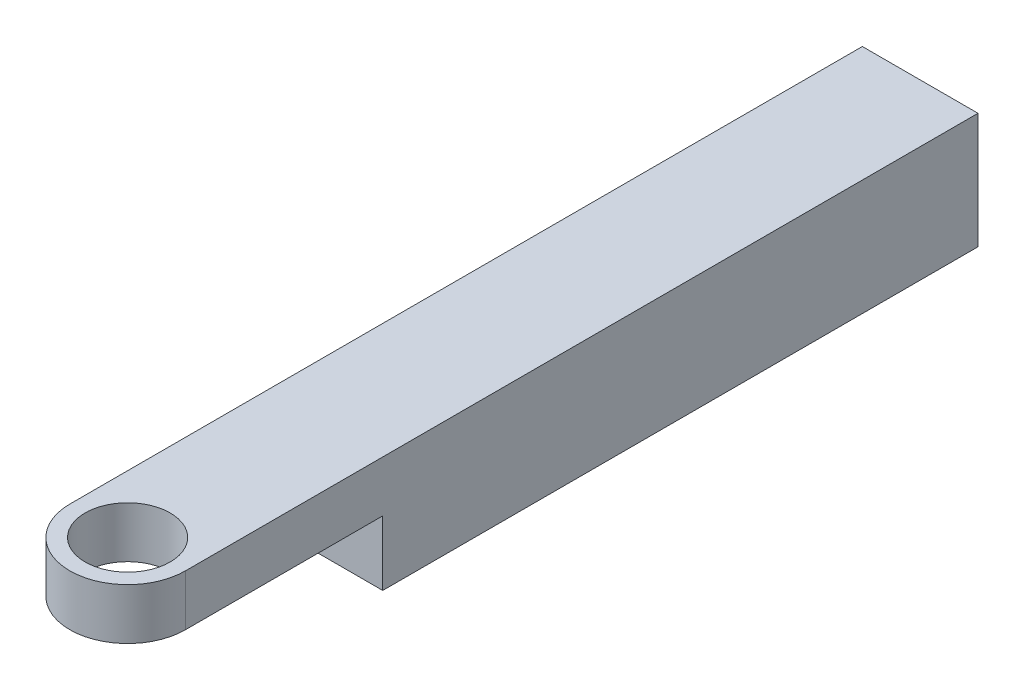
ISO-10303-21;
HEADER;
FILE_DESCRIPTION(('STEP AP214'),'2;1');
FILE_NAME('part.step','',(''),(''),'','','');
FILE_SCHEMA(('AUTOMOTIVE_DESIGN { 1 0 10303 214 1 1 1 1 }'));
ENDSEC;
DATA;
#1=APPLICATION_CONTEXT('core data for automotive mechanical design processes');
#2=APPLICATION_PROTOCOL_DEFINITION('international standard','automotive_design',2000,#1);
#3=PRODUCT_CONTEXT('',#1,'mechanical');
#4=PRODUCT('Part','Part','',(#3));
#5=PRODUCT_RELATED_PRODUCT_CATEGORY('part','',(#4));
#6=PRODUCT_DEFINITION_FORMATION('','',#4);
#7=PRODUCT_DEFINITION_CONTEXT('part definition',#1,'design');
#8=PRODUCT_DEFINITION('design','',#6,#7);
#9=PRODUCT_DEFINITION_SHAPE('','',#8);
#10=(LENGTH_UNIT() NAMED_UNIT(*) SI_UNIT(.MILLI.,.METRE.));
#11=(NAMED_UNIT(*) PLANE_ANGLE_UNIT() SI_UNIT($,.RADIAN.));
#12=(NAMED_UNIT(*) SI_UNIT($,.STERADIAN.) SOLID_ANGLE_UNIT());
#13=UNCERTAINTY_MEASURE_WITH_UNIT(LENGTH_MEASURE(1.E-05),#10,'distance_accuracy_value','');
#14=(GEOMETRIC_REPRESENTATION_CONTEXT(3) GLOBAL_UNCERTAINTY_ASSIGNED_CONTEXT((#13)) GLOBAL_UNIT_ASSIGNED_CONTEXT((#10,
#11,#12)) REPRESENTATION_CONTEXT('',''));
#15=CARTESIAN_POINT('',(0.,0.,0.));
#16=DIRECTION('',(0.,0.,1.));
#17=DIRECTION('',(1.,0.,0.));
#18=AXIS2_PLACEMENT_3D('',#15,#16,#17);
#19=CARTESIAN_POINT('',(-3.4,3.8,46.6));
#20=DIRECTION('',(0.,-1.,0.));
#21=DIRECTION('',(0.,0.,-1.));
#22=AXIS2_PLACEMENT_3D('',#19,#20,#21);
#23=CYLINDRICAL_SURFACE('',#22,3.4);
#24=DIRECTION('',(0.,1.,0.));
#25=VECTOR('',#24,1.);
#26=CARTESIAN_POINT('',(-6.8,3.8,46.6));
#27=LINE('',#26,#25);
#28=CARTESIAN_POINT('',(-6.8,3.8,46.6));
#29=VERTEX_POINT('',#28);
#30=CARTESIAN_POINT('',(-6.8,6.8,46.6));
#31=VERTEX_POINT('',#30);
#32=EDGE_CURVE('E288',#29,#31,#27,.T.);
#33=ORIENTED_EDGE('',*,*,#32,.F.);
#34=CARTESIAN_POINT('',(-3.4,3.8,46.6));
#35=DIRECTION('',(0.,1.,0.));
#36=DIRECTION('',(-1.,0.,0.));
#37=AXIS2_PLACEMENT_3D('',#34,#35,#36);
#38=CIRCLE('',#37,3.4);
#39=CARTESIAN_POINT('',(0.,3.8,46.6));
#40=VERTEX_POINT('',#39);
#41=EDGE_CURVE('E50',#40,#29,#38,.F.);
#42=ORIENTED_EDGE('',*,*,#41,.F.);
#43=DIRECTION('',(0.,1.,0.));
#44=VECTOR('',#43,1.);
#45=CARTESIAN_POINT('',(0.,3.8,46.6));
#46=LINE('',#45,#44);
#47=CARTESIAN_POINT('',(0.,6.8,46.6));
#48=VERTEX_POINT('',#47);
#49=EDGE_CURVE('E165',#48,#40,#46,.F.);
#50=ORIENTED_EDGE('',*,*,#49,.F.);
#51=CARTESIAN_POINT('',(-3.4,6.8,46.6));
#52=DIRECTION('',(0.,-1.,0.));
#53=DIRECTION('',(1.,0.,0.));
#54=AXIS2_PLACEMENT_3D('',#51,#52,#53);
#55=CIRCLE('',#54,3.4);
#56=EDGE_CURVE('E11',#31,#48,#55,.F.);
#57=ORIENTED_EDGE('',*,*,#56,.F.);
#58=EDGE_LOOP('',(#33,#42,#50,#57));
#59=FACE_BOUND('',#58,.T.);
#60=ADVANCED_FACE('F41',(#59),#23,.T.);
#61=CARTESIAN_POINT('',(0.,0.,50.));
#62=DIRECTION('',(0.,1.,0.));
#63=DIRECTION('',(-1.,0.,0.));
#64=AXIS2_PLACEMENT_3D('',#61,#62,#63);
#65=PLANE('',#64);
#66=DIRECTION('',(1.,0.,0.));
#67=VECTOR('',#66,1.);
#68=CARTESIAN_POINT('',(0.,0.,35.));
#69=LINE('',#68,#67);
#70=CARTESIAN_POINT('',(-6.8,0.,35.));
#71=VERTEX_POINT('',#70);
#72=CARTESIAN_POINT('',(0.,0.,35.));
#73=VERTEX_POINT('',#72);
#74=EDGE_CURVE('E157',#71,#73,#69,.T.);
#75=ORIENTED_EDGE('',*,*,#74,.F.);
#76=DIRECTION('',(0.,0.,-1.));
#77=VECTOR('',#76,1.);
#78=CARTESIAN_POINT('',(-6.8,0.,50.));
#79=LINE('',#78,#77);
#80=CARTESIAN_POINT('',(-6.8,0.,0.));
#81=VERTEX_POINT('',#80);
#82=EDGE_CURVE('E275',#71,#81,#79,.T.);
#83=ORIENTED_EDGE('',*,*,#82,.T.);
#84=DIRECTION('',(1.,0.,0.));
#85=VECTOR('',#84,1.);
#86=CARTESIAN_POINT('',(0.,0.,0.));
#87=LINE('',#86,#85);
#88=CARTESIAN_POINT('',(0.,0.,0.));
#89=VERTEX_POINT('',#88);
#90=EDGE_CURVE('E268',#81,#89,#87,.T.);
#91=ORIENTED_EDGE('',*,*,#90,.T.);
#92=DIRECTION('',(0.,0.,-1.));
#93=VECTOR('',#92,1.);
#94=CARTESIAN_POINT('',(0.,0.,50.));
#95=LINE('',#94,#93);
#96=EDGE_CURVE('E272',#73,#89,#95,.T.);
#97=ORIENTED_EDGE('',*,*,#96,.F.);
#98=EDGE_LOOP('',(#75,#83,#91,#97));
#99=FACE_BOUND('',#98,.T.);
#100=ADVANCED_FACE('F326',(#99),#65,.F.);
#101=CARTESIAN_POINT('',(-3.4,3.4,50.));
#102=DIRECTION('',(0.,0.,-1.));
#103=DIRECTION('',(-1.,0.,0.));
#104=AXIS2_PLACEMENT_3D('',#101,#102,#103);
#105=CYLINDRICAL_SURFACE('',#104,1.75);
#106=DIRECTION('',(0.,0.,-1.));
#107=VECTOR('',#106,1.);
#108=CARTESIAN_POINT('',(-1.69632749625992,3.8,50.));
#109=LINE('',#108,#107);
#110=CARTESIAN_POINT('',(-1.69632749625992,3.8,43.));
#111=VERTEX_POINT('',#110);
#112=CARTESIAN_POINT('',(-1.69632749625992,3.8,35.));
#113=VERTEX_POINT('',#112);
#114=EDGE_CURVE('E146',#111,#113,#109,.T.);
#115=ORIENTED_EDGE('',*,*,#114,.F.);
#116=CARTESIAN_POINT('',(-3.4,3.4,43.));
#117=DIRECTION('',(0.,0.,-1.));
#118=DIRECTION('',(-1.,0.,0.));
#119=AXIS2_PLACEMENT_3D('',#116,#117,#118);
#120=CIRCLE('',#119,1.75);
#121=CARTESIAN_POINT('',(-5.10367250374008,3.8,43.));
#122=VERTEX_POINT('',#121);
#123=EDGE_CURVE('E184',#122,#111,#120,.T.);
#124=ORIENTED_EDGE('',*,*,#123,.F.);
#125=DIRECTION('',(0.,0.,-1.));
#126=VECTOR('',#125,1.);
#127=CARTESIAN_POINT('',(-5.10367250374008,3.8,50.));
#128=LINE('',#127,#126);
#129=CARTESIAN_POINT('',(-5.10367250374008,3.8,35.));
#130=VERTEX_POINT('',#129);
#131=EDGE_CURVE('E172',#130,#122,#128,.F.);
#132=ORIENTED_EDGE('',*,*,#131,.F.);
#133=CARTESIAN_POINT('',(-3.4,3.4,35.));
#134=DIRECTION('',(0.,0.,1.));
#135=DIRECTION('',(1.,0.,0.));
#136=AXIS2_PLACEMENT_3D('',#133,#134,#135);
#137=CIRCLE('',#136,1.75);
#138=EDGE_CURVE('E180',#130,#113,#137,.T.);
#139=ORIENTED_EDGE('',*,*,#138,.T.);
#140=EDGE_LOOP('',(#115,#124,#132,#139));
#141=FACE_BOUND('',#140,.T.);
#142=CARTESIAN_POINT('',(-3.4,3.4,8.));
#143=DIRECTION('',(0.,0.,-1.));
#144=DIRECTION('',(-1.,0.,0.));
#145=AXIS2_PLACEMENT_3D('',#142,#143,#144);
#146=CIRCLE('',#145,1.75);
#147=CARTESIAN_POINT('',(-5.15,3.4,8.));
#148=VERTEX_POINT('',#147);
#149=EDGE_CURVE('E240',#148,#148,#146,.T.);
#150=ORIENTED_EDGE('',*,*,#149,.T.);
#151=EDGE_LOOP('',(#150));
#152=FACE_BOUND('',#151,.T.);
#153=ADVANCED_FACE('F331',(#141,#152),#105,.F.);
#154=CARTESIAN_POINT('',(0.,0.,0.));
#155=DIRECTION('',(0.,0.,1.));
#156=DIRECTION('',(1.,0.,0.));
#157=AXIS2_PLACEMENT_3D('',#154,#155,#156);
#158=PLANE('',#157);
#159=DIRECTION('',(0.5,0.866025403784438,0.));
#160=VECTOR('',#159,1.);
#161=CARTESIAN_POINT('',(-6.57542648054294,3.4,0.));
#162=LINE('',#161,#160);
#163=CARTESIAN_POINT('',(-6.57542648054294,3.4,0.));
#164=VERTEX_POINT('',#163);
#165=CARTESIAN_POINT('',(-4.98771324027147,6.15,0.));
#166=VERTEX_POINT('',#165);
#167=EDGE_CURVE('E218',#164,#166,#162,.T.);
#168=ORIENTED_EDGE('',*,*,#167,.F.);
#169=DIRECTION('',(-0.5,0.866025403784439,0.));
#170=VECTOR('',#169,1.);
#171=CARTESIAN_POINT('',(-4.98771324027147,0.649999999999999,0.));
#172=LINE('',#171,#170);
#173=CARTESIAN_POINT('',(-4.98771324027147,0.649999999999999,0.));
#174=VERTEX_POINT('',#173);
#175=EDGE_CURVE('E183',#174,#164,#172,.T.);
#176=ORIENTED_EDGE('',*,*,#175,.F.);
#177=DIRECTION('',(-1.,0.,0.));
#178=VECTOR('',#177,1.);
#179=CARTESIAN_POINT('',(-1.81228675972853,0.65,0.));
#180=LINE('',#179,#178);
#181=CARTESIAN_POINT('',(-1.81228675972853,0.65,0.));
#182=VERTEX_POINT('',#181);
#183=EDGE_CURVE('E195',#182,#174,#180,.T.);
#184=ORIENTED_EDGE('',*,*,#183,.F.);
#185=DIRECTION('',(-0.5,-0.866025403784438,0.));
#186=VECTOR('',#185,1.);
#187=CARTESIAN_POINT('',(-0.224573519457058,3.4,0.));
#188=LINE('',#187,#186);
#189=CARTESIAN_POINT('',(-0.224573519457058,3.4,0.));
#190=VERTEX_POINT('',#189);
#191=EDGE_CURVE('E230',#190,#182,#188,.T.);
#192=ORIENTED_EDGE('',*,*,#191,.F.);
#193=DIRECTION('',(0.5,-0.866025403784439,0.));
#194=VECTOR('',#193,1.);
#195=CARTESIAN_POINT('',(-1.81228675972853,6.15,0.));
#196=LINE('',#195,#194);
#197=CARTESIAN_POINT('',(-1.81228675972853,6.15,0.));
#198=VERTEX_POINT('',#197);
#199=EDGE_CURVE('E226',#198,#190,#196,.T.);
#200=ORIENTED_EDGE('',*,*,#199,.F.);
#201=DIRECTION('',(1.,0.,0.));
#202=VECTOR('',#201,1.);
#203=CARTESIAN_POINT('',(-4.98771324027147,6.15,0.));
#204=LINE('',#203,#202);
#205=EDGE_CURVE('E222',#166,#198,#204,.T.);
#206=ORIENTED_EDGE('',*,*,#205,.F.);
#207=EDGE_LOOP('',(#168,#176,#184,#192,#200,#206));
#208=FACE_BOUND('',#207,.T.);
#209=DIRECTION('',(0.,1.,0.));
#210=VECTOR('',#209,1.);
#211=CARTESIAN_POINT('',(0.,0.,0.));
#212=LINE('',#211,#210);
#213=CARTESIAN_POINT('',(0.,6.8,0.));
#214=VERTEX_POINT('',#213);
#215=EDGE_CURVE('E256',#89,#214,#212,.T.);
#216=ORIENTED_EDGE('',*,*,#215,.F.);
#217=ORIENTED_EDGE('',*,*,#90,.F.);
#218=DIRECTION('',(0.,-1.,0.));
#219=VECTOR('',#218,1.);
#220=CARTESIAN_POINT('',(-6.8,0.,0.));
#221=LINE('',#220,#219);
#222=CARTESIAN_POINT('',(-6.8,6.8,0.));
#223=VERTEX_POINT('',#222);
#224=EDGE_CURVE('E264',#223,#81,#221,.T.);
#225=ORIENTED_EDGE('',*,*,#224,.F.);
#226=DIRECTION('',(-1.,0.,0.));
#227=VECTOR('',#226,1.);
#228=CARTESIAN_POINT('',(0.,6.8,0.));
#229=LINE('',#228,#227);
#230=EDGE_CURVE('E260',#214,#223,#229,.T.);
#231=ORIENTED_EDGE('',*,*,#230,.F.);
#232=EDGE_LOOP('',(#216,#217,#225,#231));
#233=FACE_BOUND('',#232,.T.);
#234=ADVANCED_FACE('F338',(#208,#233),#158,.F.);
#235=CARTESIAN_POINT('',(0.,0.,50.));
#236=DIRECTION('',(-1.,0.,0.));
#237=DIRECTION('',(0.,-1.,0.));
#238=AXIS2_PLACEMENT_3D('',#235,#236,#237);
#239=PLANE('',#238);
#240=DIRECTION('',(0.,0.,-1.));
#241=VECTOR('',#240,1.);
#242=CARTESIAN_POINT('',(0.,6.8,50.));
#243=LINE('',#242,#241);
#244=EDGE_CURVE('E189',#48,#214,#243,.T.);
#245=ORIENTED_EDGE('',*,*,#244,.F.);
#246=ORIENTED_EDGE('',*,*,#49,.T.);
#247=DIRECTION('',(0.,0.,1.));
#248=VECTOR('',#247,1.);
#249=CARTESIAN_POINT('',(0.,3.8,35.));
#250=LINE('',#249,#248);
#251=CARTESIAN_POINT('',(0.,3.8,35.));
#252=VERTEX_POINT('',#251);
#253=EDGE_CURVE('E144',#252,#40,#250,.T.);
#254=ORIENTED_EDGE('',*,*,#253,.F.);
#255=DIRECTION('',(0.,1.,0.));
#256=VECTOR('',#255,1.);
#257=CARTESIAN_POINT('',(0.,0.,35.));
#258=LINE('',#257,#256);
#259=EDGE_CURVE('E154',#73,#252,#258,.T.);
#260=ORIENTED_EDGE('',*,*,#259,.F.);
#261=ORIENTED_EDGE('',*,*,#96,.T.);
#262=ORIENTED_EDGE('',*,*,#215,.T.);
#263=EDGE_LOOP('',(#245,#246,#254,#260,#261,#262));
#264=FACE_BOUND('',#263,.T.);
#265=ADVANCED_FACE('F164',(#264),#239,.F.);
#266=CARTESIAN_POINT('',(0.,6.8,50.));
#267=DIRECTION('',(0.,-1.,0.));
#268=DIRECTION('',(1.,0.,0.));
#269=AXIS2_PLACEMENT_3D('',#266,#267,#268);
#270=PLANE('',#269);
#271=CARTESIAN_POINT('',(-3.4,6.8,46.6));
#272=DIRECTION('',(0.,-1.,0.));
#273=DIRECTION('',(1.,0.,0.));
#274=AXIS2_PLACEMENT_3D('',#271,#272,#273);
#275=CIRCLE('',#274,2.5);
#276=CARTESIAN_POINT('',(-0.899999999999998,6.8,46.6));
#277=VERTEX_POINT('',#276);
#278=EDGE_CURVE('E161',#277,#277,#275,.T.);
#279=ORIENTED_EDGE('',*,*,#278,.T.);
#280=EDGE_LOOP('',(#279));
#281=FACE_BOUND('',#280,.T.);
#282=DIRECTION('',(0.,0.,-1.));
#283=VECTOR('',#282,1.);
#284=CARTESIAN_POINT('',(-6.8,6.8,50.));
#285=LINE('',#284,#283);
#286=EDGE_CURVE('E278',#31,#223,#285,.T.);
#287=ORIENTED_EDGE('',*,*,#286,.F.);
#288=ORIENTED_EDGE('',*,*,#56,.T.);
#289=ORIENTED_EDGE('',*,*,#244,.T.);
#290=ORIENTED_EDGE('',*,*,#230,.T.);
#291=EDGE_LOOP('',(#287,#288,#289,#290));
#292=FACE_BOUND('',#291,.T.);
#293=ADVANCED_FACE('F346',(#281,#292),#270,.F.);
#294=CARTESIAN_POINT('',(-6.8,0.,50.));
#295=DIRECTION('',(1.,0.,0.));
#296=DIRECTION('',(0.,0.,-1.));
#297=AXIS2_PLACEMENT_3D('',#294,#295,#296);
#298=PLANE('',#297);
#299=DIRECTION('',(0.,0.,1.));
#300=VECTOR('',#299,1.);
#301=CARTESIAN_POINT('',(-6.8,3.8,35.));
#302=LINE('',#301,#300);
#303=CARTESIAN_POINT('',(-6.8,3.8,35.));
#304=VERTEX_POINT('',#303);
#305=EDGE_CURVE('E167',#304,#29,#302,.T.);
#306=ORIENTED_EDGE('',*,*,#305,.T.);
#307=ORIENTED_EDGE('',*,*,#32,.T.);
#308=ORIENTED_EDGE('',*,*,#286,.T.);
#309=ORIENTED_EDGE('',*,*,#224,.T.);
#310=ORIENTED_EDGE('',*,*,#82,.F.);
#311=DIRECTION('',(0.,-1.,0.));
#312=VECTOR('',#311,1.);
#313=CARTESIAN_POINT('',(-6.8,0.,35.));
#314=LINE('',#313,#312);
#315=EDGE_CURVE('E150',#304,#71,#314,.T.);
#316=ORIENTED_EDGE('',*,*,#315,.F.);
#317=EDGE_LOOP('',(#306,#307,#308,#309,#310,#316));
#318=FACE_BOUND('',#317,.T.);
#319=ADVANCED_FACE('F298',(#318),#298,.F.);
#320=CARTESIAN_POINT('',(-4.98771324027147,0.649999999999999,8.));
#321=DIRECTION('',(-0.866025403784439,-0.5,0.));
#322=DIRECTION('',(0.5,-0.866025403784439,0.));
#323=AXIS2_PLACEMENT_3D('',#320,#321,#322);
#324=PLANE('',#323);
#325=ORIENTED_EDGE('',*,*,#175,.T.);
#326=DIRECTION('',(0.,0.,-1.));
#327=VECTOR('',#326,1.);
#328=CARTESIAN_POINT('',(-6.57542648054294,3.4,8.));
#329=LINE('',#328,#327);
#330=CARTESIAN_POINT('',(-6.57542648054294,3.4,8.));
#331=VERTEX_POINT('',#330);
#332=EDGE_CURVE('E215',#331,#164,#329,.T.);
#333=ORIENTED_EDGE('',*,*,#332,.F.);
#334=DIRECTION('',(-0.5,0.866025403784439,0.));
#335=VECTOR('',#334,1.);
#336=CARTESIAN_POINT('',(-4.98771324027147,0.649999999999999,8.));
#337=LINE('',#336,#335);
#338=CARTESIAN_POINT('',(-4.98771324027147,0.649999999999999,8.));
#339=VERTEX_POINT('',#338);
#340=EDGE_CURVE('E190',#339,#331,#337,.T.);
#341=ORIENTED_EDGE('',*,*,#340,.F.);
#342=DIRECTION('',(0.,0.,-1.));
#343=VECTOR('',#342,1.);
#344=CARTESIAN_POINT('',(-4.98771324027147,0.649999999999999,8.));
#345=LINE('',#344,#343);
#346=EDGE_CURVE('E237',#339,#174,#345,.T.);
#347=ORIENTED_EDGE('',*,*,#346,.T.);
#348=EDGE_LOOP('',(#325,#333,#341,#347));
#349=FACE_BOUND('',#348,.T.);
#350=ADVANCED_FACE('F345',(#349),#324,.F.);
#351=CARTESIAN_POINT('',(-1.81228675972853,0.65,8.));
#352=DIRECTION('',(0.,-1.,0.));
#353=DIRECTION('',(1.,0.,0.));
#354=AXIS2_PLACEMENT_3D('',#351,#352,#353);
#355=PLANE('',#354);
#356=ORIENTED_EDGE('',*,*,#183,.T.);
#357=ORIENTED_EDGE('',*,*,#346,.F.);
#358=DIRECTION('',(-1.,0.,0.));
#359=VECTOR('',#358,1.);
#360=CARTESIAN_POINT('',(-1.81228675972853,0.65,8.));
#361=LINE('',#360,#359);
#362=CARTESIAN_POINT('',(-1.81228675972853,0.65,8.));
#363=VERTEX_POINT('',#362);
#364=EDGE_CURVE('E211',#363,#339,#361,.T.);
#365=ORIENTED_EDGE('',*,*,#364,.F.);
#366=DIRECTION('',(0.,0.,-1.));
#367=VECTOR('',#366,1.);
#368=CARTESIAN_POINT('',(-1.81228675972853,0.65,8.));
#369=LINE('',#368,#367);
#370=EDGE_CURVE('E241',#363,#182,#369,.T.);
#371=ORIENTED_EDGE('',*,*,#370,.T.);
#372=EDGE_LOOP('',(#356,#357,#365,#371));
#373=FACE_BOUND('',#372,.T.);
#374=ADVANCED_FACE('F375',(#373),#355,.F.);
#375=CARTESIAN_POINT('',(-0.224573519457058,3.4,8.));
#376=DIRECTION('',(0.866025403784439,-0.5,0.));
#377=DIRECTION('',(0.5,0.866025403784439,0.));
#378=AXIS2_PLACEMENT_3D('',#375,#376,#377);
#379=PLANE('',#378);
#380=ORIENTED_EDGE('',*,*,#191,.T.);
#381=ORIENTED_EDGE('',*,*,#370,.F.);
#382=DIRECTION('',(-0.5,-0.866025403784438,0.));
#383=VECTOR('',#382,1.);
#384=CARTESIAN_POINT('',(-0.224573519457058,3.4,8.));
#385=LINE('',#384,#383);
#386=CARTESIAN_POINT('',(-0.224573519457058,3.4,8.));
#387=VERTEX_POINT('',#386);
#388=EDGE_CURVE('E207',#387,#363,#385,.T.);
#389=ORIENTED_EDGE('',*,*,#388,.F.);
#390=DIRECTION('',(0.,0.,-1.));
#391=VECTOR('',#390,1.);
#392=CARTESIAN_POINT('',(-0.224573519457058,3.4,8.));
#393=LINE('',#392,#391);
#394=EDGE_CURVE('E244',#387,#190,#393,.T.);
#395=ORIENTED_EDGE('',*,*,#394,.T.);
#396=EDGE_LOOP('',(#380,#381,#389,#395));
#397=FACE_BOUND('',#396,.T.);
#398=ADVANCED_FACE('F378',(#397),#379,.F.);
#399=CARTESIAN_POINT('',(-1.81228675972853,6.15,8.));
#400=DIRECTION('',(0.866025403784439,0.5,0.));
#401=DIRECTION('',(-0.5,0.866025403784439,0.));
#402=AXIS2_PLACEMENT_3D('',#399,#400,#401);
#403=PLANE('',#402);
#404=ORIENTED_EDGE('',*,*,#199,.T.);
#405=ORIENTED_EDGE('',*,*,#394,.F.);
#406=DIRECTION('',(0.5,-0.866025403784439,0.));
#407=VECTOR('',#406,1.);
#408=CARTESIAN_POINT('',(-1.81228675972853,6.15,8.));
#409=LINE('',#408,#407);
#410=CARTESIAN_POINT('',(-1.81228675972853,6.15,8.));
#411=VERTEX_POINT('',#410);
#412=EDGE_CURVE('E203',#411,#387,#409,.T.);
#413=ORIENTED_EDGE('',*,*,#412,.F.);
#414=DIRECTION('',(0.,0.,-1.));
#415=VECTOR('',#414,1.);
#416=CARTESIAN_POINT('',(-1.81228675972853,6.15,8.));
#417=LINE('',#416,#415);
#418=EDGE_CURVE('E247',#411,#198,#417,.T.);
#419=ORIENTED_EDGE('',*,*,#418,.T.);
#420=EDGE_LOOP('',(#404,#405,#413,#419));
#421=FACE_BOUND('',#420,.T.);
#422=ADVANCED_FACE('F382',(#421),#403,.F.);
#423=CARTESIAN_POINT('',(-4.98771324027147,6.15,8.));
#424=DIRECTION('',(0.,1.,0.));
#425=DIRECTION('',(0.,0.,1.));
#426=AXIS2_PLACEMENT_3D('',#423,#424,#425);
#427=PLANE('',#426);
#428=ORIENTED_EDGE('',*,*,#205,.T.);
#429=ORIENTED_EDGE('',*,*,#418,.F.);
#430=DIRECTION('',(1.,0.,0.));
#431=VECTOR('',#430,1.);
#432=CARTESIAN_POINT('',(-4.98771324027147,6.15,8.));
#433=LINE('',#432,#431);
#434=CARTESIAN_POINT('',(-4.98771324027147,6.15,8.));
#435=VERTEX_POINT('',#434);
#436=EDGE_CURVE('E199',#435,#411,#433,.T.);
#437=ORIENTED_EDGE('',*,*,#436,.F.);
#438=DIRECTION('',(0.,0.,-1.));
#439=VECTOR('',#438,1.);
#440=CARTESIAN_POINT('',(-4.98771324027147,6.15,8.));
#441=LINE('',#440,#439);
#442=EDGE_CURVE('E250',#435,#166,#441,.T.);
#443=ORIENTED_EDGE('',*,*,#442,.T.);
#444=EDGE_LOOP('',(#428,#429,#437,#443));
#445=FACE_BOUND('',#444,.T.);
#446=ADVANCED_FACE('F384',(#445),#427,.F.);
#447=CARTESIAN_POINT('',(-6.57542648054294,3.4,8.));
#448=DIRECTION('',(-0.866025403784439,0.5,0.));
#449=DIRECTION('',(-0.5,-0.866025403784438,0.));
#450=AXIS2_PLACEMENT_3D('',#447,#448,#449);
#451=PLANE('',#450);
#452=ORIENTED_EDGE('',*,*,#167,.T.);
#453=ORIENTED_EDGE('',*,*,#442,.F.);
#454=DIRECTION('',(0.5,0.866025403784438,0.));
#455=VECTOR('',#454,1.);
#456=CARTESIAN_POINT('',(-6.57542648054294,3.4,8.));
#457=LINE('',#456,#455);
#458=EDGE_CURVE('E194',#331,#435,#457,.T.);
#459=ORIENTED_EDGE('',*,*,#458,.F.);
#460=ORIENTED_EDGE('',*,*,#332,.T.);
#461=EDGE_LOOP('',(#452,#453,#459,#460));
#462=FACE_BOUND('',#461,.T.);
#463=ADVANCED_FACE('F368',(#462),#451,.F.);
#464=CARTESIAN_POINT('',(0.,0.,8.));
#465=DIRECTION('',(0.,0.,-1.));
#466=DIRECTION('',(-1.,0.,0.));
#467=AXIS2_PLACEMENT_3D('',#464,#465,#466);
#468=PLANE('',#467);
#469=ORIENTED_EDGE('',*,*,#149,.F.);
#470=EDGE_LOOP('',(#469));
#471=FACE_BOUND('',#470,.T.);
#472=ORIENTED_EDGE('',*,*,#340,.T.);
#473=ORIENTED_EDGE('',*,*,#458,.T.);
#474=ORIENTED_EDGE('',*,*,#436,.T.);
#475=ORIENTED_EDGE('',*,*,#412,.T.);
#476=ORIENTED_EDGE('',*,*,#388,.T.);
#477=ORIENTED_EDGE('',*,*,#364,.T.);
#478=EDGE_LOOP('',(#472,#473,#474,#475,#476,#477));
#479=FACE_BOUND('',#478,.T.);
#480=ADVANCED_FACE('F322',(#471,#479),#468,.T.);
#481=CARTESIAN_POINT('',(0.,0.,43.));
#482=DIRECTION('',(0.,0.,-1.));
#483=DIRECTION('',(-1.,0.,0.));
#484=AXIS2_PLACEMENT_3D('',#481,#482,#483);
#485=PLANE('',#484);
#486=DIRECTION('',(1.,0.,0.));
#487=VECTOR('',#486,1.);
#488=CARTESIAN_POINT('',(0.,3.8,43.));
#489=LINE('',#488,#487);
#490=EDGE_CURVE('E188',#122,#111,#489,.T.);
#491=ORIENTED_EDGE('',*,*,#490,.F.);
#492=ORIENTED_EDGE('',*,*,#123,.T.);
#493=EDGE_LOOP('',(#491,#492));
#494=FACE_BOUND('',#493,.T.);
#495=ADVANCED_FACE('F315',(#494),#485,.T.);
#496=CARTESIAN_POINT('',(0.,3.8,35.));
#497=DIRECTION('',(0.,1.,0.));
#498=DIRECTION('',(-1.,0.,0.));
#499=AXIS2_PLACEMENT_3D('',#496,#497,#498);
#500=PLANE('',#499);
#501=CARTESIAN_POINT('',(-3.4,3.8,46.6));
#502=DIRECTION('',(0.,-1.,0.));
#503=DIRECTION('',(1.,0.,0.));
#504=AXIS2_PLACEMENT_3D('',#501,#502,#503);
#505=CIRCLE('',#504,2.5);
#506=CARTESIAN_POINT('',(-0.899999999999998,3.8,46.6));
#507=VERTEX_POINT('',#506);
#508=EDGE_CURVE('E306',#507,#507,#505,.T.);
#509=ORIENTED_EDGE('',*,*,#508,.F.);
#510=EDGE_LOOP('',(#509));
#511=FACE_BOUND('',#510,.T.);
#512=ORIENTED_EDGE('',*,*,#253,.T.);
#513=ORIENTED_EDGE('',*,*,#41,.T.);
#514=ORIENTED_EDGE('',*,*,#305,.F.);
#515=DIRECTION('',(-1.,0.,0.));
#516=VECTOR('',#515,1.);
#517=CARTESIAN_POINT('',(0.,3.8,35.));
#518=LINE('',#517,#516);
#519=EDGE_CURVE('E151',#130,#304,#518,.T.);
#520=ORIENTED_EDGE('',*,*,#519,.F.);
#521=ORIENTED_EDGE('',*,*,#131,.T.);
#522=ORIENTED_EDGE('',*,*,#490,.T.);
#523=ORIENTED_EDGE('',*,*,#114,.T.);
#524=EDGE_CURVE('E140',#252,#113,#518,.T.);
#525=ORIENTED_EDGE('',*,*,#524,.F.);
#526=EDGE_LOOP('',(#512,#513,#514,#520,#521,#522,#523,#525));
#527=FACE_BOUND('',#526,.T.);
#528=ADVANCED_FACE('F142',(#511,#527),#500,.F.);
#529=CARTESIAN_POINT('',(0.,0.,35.));
#530=DIRECTION('',(0.,0.,1.));
#531=DIRECTION('',(1.,0.,0.));
#532=AXIS2_PLACEMENT_3D('',#529,#530,#531);
#533=PLANE('',#532);
#534=ORIENTED_EDGE('',*,*,#519,.T.);
#535=ORIENTED_EDGE('',*,*,#315,.T.);
#536=ORIENTED_EDGE('',*,*,#74,.T.);
#537=ORIENTED_EDGE('',*,*,#259,.T.);
#538=ORIENTED_EDGE('',*,*,#524,.T.);
#539=ORIENTED_EDGE('',*,*,#138,.F.);
#540=EDGE_LOOP('',(#534,#535,#536,#537,#538,#539));
#541=FACE_BOUND('',#540,.T.);
#542=ADVANCED_FACE('F155',(#541),#533,.T.);
#543=CARTESIAN_POINT('',(-3.4,23.8,46.6));
#544=DIRECTION('',(0.,-1.,0.));
#545=DIRECTION('',(1.,0.,0.));
#546=AXIS2_PLACEMENT_3D('',#543,#544,#545);
#547=CYLINDRICAL_SURFACE('',#546,2.5);
#548=ORIENTED_EDGE('',*,*,#508,.T.);
#549=EDGE_LOOP('',(#548));
#550=FACE_BOUND('',#549,.T.);
#551=ORIENTED_EDGE('',*,*,#278,.F.);
#552=EDGE_LOOP('',(#551));
#553=FACE_BOUND('',#552,.T.);
#554=ADVANCED_FACE('F311',(#550,#553),#547,.F.);
#555=CLOSED_SHELL('',(#60,#100,#153,#234,#265,#293,#319,#350,#374,#398,#422,#446,#463,#480,#495,
#528,#542,#554));
#556=MANIFOLD_SOLID_BREP('B2',#555);
#557=ADVANCED_BREP_SHAPE_REPRESENTATION('',(#18,#556),#14);
#558=SHAPE_DEFINITION_REPRESENTATION(#9,#557);
ENDSEC;
END-ISO-10303-21;
